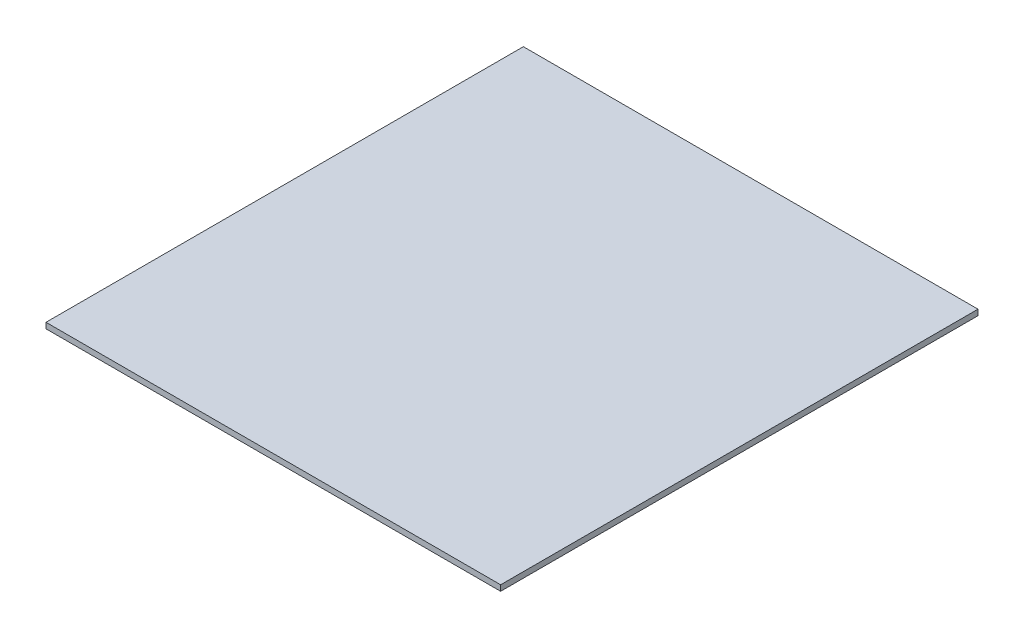
ISO-10303-21;
HEADER;
FILE_DESCRIPTION(('STEP AP214'),'2;1');
FILE_NAME('part.step','',(''),(''),'','','');
FILE_SCHEMA(('AUTOMOTIVE_DESIGN { 1 0 10303 214 1 1 1 1 }'));
ENDSEC;
DATA;
#1=APPLICATION_CONTEXT('core data for automotive mechanical design processes');
#2=APPLICATION_PROTOCOL_DEFINITION('international standard','automotive_design',2000,#1);
#3=PRODUCT_CONTEXT('',#1,'mechanical');
#4=PRODUCT('Part','Part','',(#3));
#5=PRODUCT_RELATED_PRODUCT_CATEGORY('part','',(#4));
#6=PRODUCT_DEFINITION_FORMATION('','',#4);
#7=PRODUCT_DEFINITION_CONTEXT('part definition',#1,'design');
#8=PRODUCT_DEFINITION('design','',#6,#7);
#9=PRODUCT_DEFINITION_SHAPE('','',#8);
#10=(LENGTH_UNIT() NAMED_UNIT(*) SI_UNIT(.MILLI.,.METRE.));
#11=(NAMED_UNIT(*) PLANE_ANGLE_UNIT() SI_UNIT($,.RADIAN.));
#12=(NAMED_UNIT(*) SI_UNIT($,.STERADIAN.) SOLID_ANGLE_UNIT());
#13=UNCERTAINTY_MEASURE_WITH_UNIT(LENGTH_MEASURE(1.E-05),#10,'distance_accuracy_value','');
#14=(GEOMETRIC_REPRESENTATION_CONTEXT(3) GLOBAL_UNCERTAINTY_ASSIGNED_CONTEXT((#13)) GLOBAL_UNIT_ASSIGNED_CONTEXT((#10,
#11,#12)) REPRESENTATION_CONTEXT('',''));
#15=CARTESIAN_POINT('',(0.,0.,0.));
#16=DIRECTION('',(0.,0.,1.));
#17=DIRECTION('',(1.,0.,0.));
#18=AXIS2_PLACEMENT_3D('',#15,#16,#17);
#19=CARTESIAN_POINT('',(254.,6.35,266.7));
#20=DIRECTION('',(-1.,0.,0.));
#21=DIRECTION('',(0.,0.,1.));
#22=AXIS2_PLACEMENT_3D('',#19,#20,#21);
#23=PLANE('',#22);
#24=DIRECTION('',(0.,0.,-1.));
#25=VECTOR('',#24,1.);
#26=CARTESIAN_POINT('',(254.,0.,266.7));
#27=LINE('',#26,#25);
#28=CARTESIAN_POINT('',(254.,0.,266.7));
#29=VERTEX_POINT('',#28);
#30=CARTESIAN_POINT('',(254.,0.,-266.7));
#31=VERTEX_POINT('',#30);
#32=EDGE_CURVE('E111',#29,#31,#27,.T.);
#33=ORIENTED_EDGE('',*,*,#32,.T.);
#34=DIRECTION('',(0.,-1.,0.));
#35=VECTOR('',#34,1.);
#36=CARTESIAN_POINT('',(254.,6.35,-266.7));
#37=LINE('',#36,#35);
#38=CARTESIAN_POINT('',(254.,6.35,-266.7));
#39=VERTEX_POINT('',#38);
#40=EDGE_CURVE('E11',#39,#31,#37,.T.);
#41=ORIENTED_EDGE('',*,*,#40,.F.);
#42=DIRECTION('',(0.,0.,-1.));
#43=VECTOR('',#42,1.);
#44=CARTESIAN_POINT('',(254.,6.35,266.7));
#45=LINE('',#44,#43);
#46=CARTESIAN_POINT('',(254.,6.35,266.7));
#47=VERTEX_POINT('',#46);
#48=EDGE_CURVE('E95',#47,#39,#45,.T.);
#49=ORIENTED_EDGE('',*,*,#48,.F.);
#50=DIRECTION('',(0.,-1.,0.));
#51=VECTOR('',#50,1.);
#52=CARTESIAN_POINT('',(254.,6.35,266.7));
#53=LINE('',#52,#51);
#54=EDGE_CURVE('E107',#47,#29,#53,.T.);
#55=ORIENTED_EDGE('',*,*,#54,.T.);
#56=EDGE_LOOP('',(#33,#41,#49,#55));
#57=FACE_BOUND('',#56,.T.);
#58=ADVANCED_FACE('F43',(#57),#23,.F.);
#59=CARTESIAN_POINT('',(-254.,6.35,-266.7));
#60=DIRECTION('',(0.,0.,1.));
#61=DIRECTION('',(1.,0.,0.));
#62=AXIS2_PLACEMENT_3D('',#59,#60,#61);
#63=PLANE('',#62);
#64=DIRECTION('',(-1.,0.,0.));
#65=VECTOR('',#64,1.);
#66=CARTESIAN_POINT('',(-254.,0.,-266.7));
#67=LINE('',#66,#65);
#68=CARTESIAN_POINT('',(-254.,0.,-266.7));
#69=VERTEX_POINT('',#68);
#70=EDGE_CURVE('E100',#31,#69,#67,.T.);
#71=ORIENTED_EDGE('',*,*,#70,.T.);
#72=DIRECTION('',(0.,-1.,0.));
#73=VECTOR('',#72,1.);
#74=CARTESIAN_POINT('',(-254.,6.35,-266.7));
#75=LINE('',#74,#73);
#76=CARTESIAN_POINT('',(-254.,6.35,-266.7));
#77=VERTEX_POINT('',#76);
#78=EDGE_CURVE('E52',#77,#69,#75,.T.);
#79=ORIENTED_EDGE('',*,*,#78,.F.);
#80=DIRECTION('',(-1.,0.,0.));
#81=VECTOR('',#80,1.);
#82=CARTESIAN_POINT('',(-254.,6.35,-266.7));
#83=LINE('',#82,#81);
#84=EDGE_CURVE('E90',#39,#77,#83,.T.);
#85=ORIENTED_EDGE('',*,*,#84,.F.);
#86=ORIENTED_EDGE('',*,*,#40,.T.);
#87=EDGE_LOOP('',(#71,#79,#85,#86));
#88=FACE_BOUND('',#87,.T.);
#89=ADVANCED_FACE('F99',(#88),#63,.F.);
#90=CARTESIAN_POINT('',(-254.,6.35,266.7));
#91=DIRECTION('',(1.,0.,0.));
#92=DIRECTION('',(0.,0.,-1.));
#93=AXIS2_PLACEMENT_3D('',#90,#91,#92);
#94=PLANE('',#93);
#95=DIRECTION('',(0.,0.,1.));
#96=VECTOR('',#95,1.);
#97=CARTESIAN_POINT('',(-254.,0.,266.7));
#98=LINE('',#97,#96);
#99=CARTESIAN_POINT('',(-254.,0.,266.7));
#100=VERTEX_POINT('',#99);
#101=EDGE_CURVE('E77',#69,#100,#98,.T.);
#102=ORIENTED_EDGE('',*,*,#101,.T.);
#103=DIRECTION('',(0.,-1.,0.));
#104=VECTOR('',#103,1.);
#105=CARTESIAN_POINT('',(-254.,6.35,266.7));
#106=LINE('',#105,#104);
#107=CARTESIAN_POINT('',(-254.,6.35,266.7));
#108=VERTEX_POINT('',#107);
#109=EDGE_CURVE('E102',#108,#100,#106,.T.);
#110=ORIENTED_EDGE('',*,*,#109,.F.);
#111=DIRECTION('',(0.,0.,1.));
#112=VECTOR('',#111,1.);
#113=CARTESIAN_POINT('',(-254.,6.35,266.7));
#114=LINE('',#113,#112);
#115=EDGE_CURVE('E93',#77,#108,#114,.T.);
#116=ORIENTED_EDGE('',*,*,#115,.F.);
#117=ORIENTED_EDGE('',*,*,#78,.T.);
#118=EDGE_LOOP('',(#102,#110,#116,#117));
#119=FACE_BOUND('',#118,.T.);
#120=ADVANCED_FACE('F103',(#119),#94,.F.);
#121=CARTESIAN_POINT('',(-254.,6.35,266.7));
#122=DIRECTION('',(0.,0.,-1.));
#123=DIRECTION('',(-1.,0.,0.));
#124=AXIS2_PLACEMENT_3D('',#121,#122,#123);
#125=PLANE('',#124);
#126=DIRECTION('',(1.,0.,0.));
#127=VECTOR('',#126,1.);
#128=CARTESIAN_POINT('',(-254.,0.,266.7));
#129=LINE('',#128,#127);
#130=EDGE_CURVE('E83',#100,#29,#129,.T.);
#131=ORIENTED_EDGE('',*,*,#130,.T.);
#132=ORIENTED_EDGE('',*,*,#54,.F.);
#133=DIRECTION('',(1.,0.,0.));
#134=VECTOR('',#133,1.);
#135=CARTESIAN_POINT('',(-254.,6.35,266.7));
#136=LINE('',#135,#134);
#137=EDGE_CURVE('E60',#108,#47,#136,.T.);
#138=ORIENTED_EDGE('',*,*,#137,.F.);
#139=ORIENTED_EDGE('',*,*,#109,.T.);
#140=EDGE_LOOP('',(#131,#132,#138,#139));
#141=FACE_BOUND('',#140,.T.);
#142=ADVANCED_FACE('F124',(#141),#125,.F.);
#143=CARTESIAN_POINT('',(0.,6.35,0.));
#144=DIRECTION('',(0.,-1.,0.));
#145=DIRECTION('',(0.,0.,-1.));
#146=AXIS2_PLACEMENT_3D('',#143,#144,#145);
#147=PLANE('',#146);
#148=ORIENTED_EDGE('',*,*,#48,.T.);
#149=ORIENTED_EDGE('',*,*,#84,.T.);
#150=ORIENTED_EDGE('',*,*,#115,.T.);
#151=ORIENTED_EDGE('',*,*,#137,.T.);
#152=EDGE_LOOP('',(#148,#149,#150,#151));
#153=FACE_BOUND('',#152,.T.);
#154=ADVANCED_FACE('F91',(#153),#147,.F.);
#155=CARTESIAN_POINT('',(0.,0.,0.));
#156=DIRECTION('',(0.,-1.,0.));
#157=DIRECTION('',(0.,0.,-1.));
#158=AXIS2_PLACEMENT_3D('',#155,#156,#157);
#159=PLANE('',#158);
#160=ORIENTED_EDGE('',*,*,#32,.F.);
#161=ORIENTED_EDGE('',*,*,#130,.F.);
#162=ORIENTED_EDGE('',*,*,#101,.F.);
#163=ORIENTED_EDGE('',*,*,#70,.F.);
#164=EDGE_LOOP('',(#160,#161,#162,#163));
#165=FACE_BOUND('',#164,.T.);
#166=ADVANCED_FACE('F127',(#165),#159,.T.);
#167=CLOSED_SHELL('',(#58,#89,#120,#142,#154,#166));
#168=MANIFOLD_SOLID_BREP('B2',#167);
#169=ADVANCED_BREP_SHAPE_REPRESENTATION('',(#18,#168),#14);
#170=SHAPE_DEFINITION_REPRESENTATION(#9,#169);
ENDSEC;
END-ISO-10303-21;
